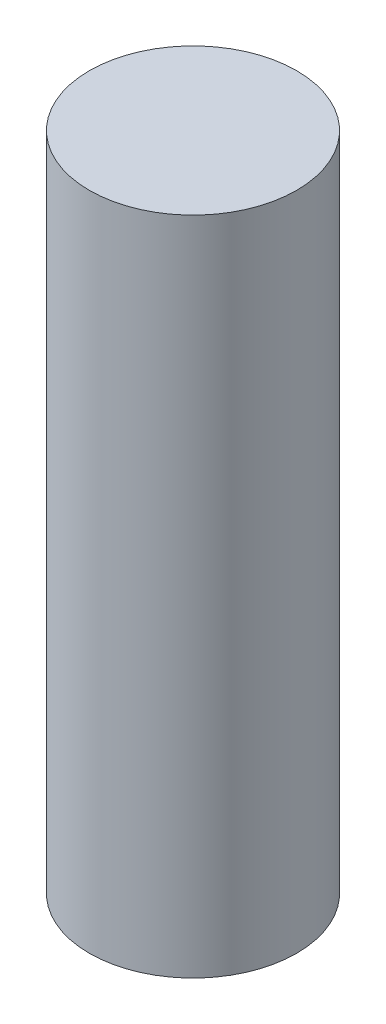
ISO-10303-21;
HEADER;
FILE_DESCRIPTION(('STEP AP214'),'2;1');
FILE_NAME('part.step','',(''),(''),'','','');
FILE_SCHEMA(('AUTOMOTIVE_DESIGN { 1 0 10303 214 1 1 1 1 }'));
ENDSEC;
DATA;
#1=APPLICATION_CONTEXT('core data for automotive mechanical design processes');
#2=APPLICATION_PROTOCOL_DEFINITION('international standard','automotive_design',2000,#1);
#3=PRODUCT_CONTEXT('',#1,'mechanical');
#4=PRODUCT('Part','Part','',(#3));
#5=PRODUCT_RELATED_PRODUCT_CATEGORY('part','',(#4));
#6=PRODUCT_DEFINITION_FORMATION('','',#4);
#7=PRODUCT_DEFINITION_CONTEXT('part definition',#1,'design');
#8=PRODUCT_DEFINITION('design','',#6,#7);
#9=PRODUCT_DEFINITION_SHAPE('','',#8);
#10=(LENGTH_UNIT() NAMED_UNIT(*) SI_UNIT(.MILLI.,.METRE.));
#11=(NAMED_UNIT(*) PLANE_ANGLE_UNIT() SI_UNIT($,.RADIAN.));
#12=(NAMED_UNIT(*) SI_UNIT($,.STERADIAN.) SOLID_ANGLE_UNIT());
#13=UNCERTAINTY_MEASURE_WITH_UNIT(LENGTH_MEASURE(1.E-05),#10,'distance_accuracy_value','');
#14=(GEOMETRIC_REPRESENTATION_CONTEXT(3) GLOBAL_UNCERTAINTY_ASSIGNED_CONTEXT((#13)) GLOBAL_UNIT_ASSIGNED_CONTEXT((#10,
#11,#12)) REPRESENTATION_CONTEXT('',''));
#15=CARTESIAN_POINT('',(0.,0.,0.));
#16=DIRECTION('',(0.,0.,1.));
#17=DIRECTION('',(1.,0.,0.));
#18=AXIS2_PLACEMENT_3D('',#15,#16,#17);
#19=CARTESIAN_POINT('',(0.,0.,0.));
#20=DIRECTION('',(0.,-1.,0.));
#21=DIRECTION('',(0.,0.,-1.));
#22=AXIS2_PLACEMENT_3D('',#19,#20,#21);
#23=PLANE('',#22);
#24=CARTESIAN_POINT('',(0.,0.,0.));
#25=DIRECTION('',(0.,-1.,0.));
#26=DIRECTION('',(0.,0.,-1.));
#27=AXIS2_PLACEMENT_3D('',#24,#25,#26);
#28=CIRCLE('',#27,4.);
#29=CARTESIAN_POINT('',(0.,0.,-4.));
#30=VERTEX_POINT('',#29);
#31=EDGE_CURVE('E10',#30,#30,#28,.T.);
#32=ORIENTED_EDGE('',*,*,#31,.T.);
#33=EDGE_LOOP('',(#32));
#34=FACE_BOUND('',#33,.T.);
#35=ADVANCED_FACE('F37',(#34),#23,.T.);
#36=CARTESIAN_POINT('',(0.,0.,0.));
#37=DIRECTION('',(0.,-1.,0.));
#38=DIRECTION('',(0.,0.,-1.));
#39=AXIS2_PLACEMENT_3D('',#36,#37,#38);
#40=CYLINDRICAL_SURFACE('',#39,4.);
#41=CARTESIAN_POINT('',(0.,25.5,0.));
#42=DIRECTION('',(0.,-1.,0.));
#43=DIRECTION('',(0.,0.,-1.));
#44=AXIS2_PLACEMENT_3D('',#41,#42,#43);
#45=CIRCLE('',#44,4.);
#46=CARTESIAN_POINT('',(0.,25.5,-4.));
#47=VERTEX_POINT('',#46);
#48=EDGE_CURVE('E43',#47,#47,#45,.T.);
#49=ORIENTED_EDGE('',*,*,#48,.T.);
#50=EDGE_LOOP('',(#49));
#51=FACE_BOUND('',#50,.T.);
#52=ORIENTED_EDGE('',*,*,#31,.F.);
#53=EDGE_LOOP('',(#52));
#54=FACE_BOUND('',#53,.T.);
#55=ADVANCED_FACE('F49',(#51,#54),#40,.T.);
#56=CARTESIAN_POINT('',(4.,25.5,0.));
#57=DIRECTION('',(0.,1.,0.));
#58=DIRECTION('',(0.,0.,1.));
#59=AXIS2_PLACEMENT_3D('',#56,#57,#58);
#60=PLANE('',#59);
#61=ORIENTED_EDGE('',*,*,#48,.F.);
#62=EDGE_LOOP('',(#61));
#63=FACE_BOUND('',#62,.T.);
#64=ADVANCED_FACE('F52',(#63),#60,.T.);
#65=CLOSED_SHELL('',(#35,#55,#64));
#66=MANIFOLD_SOLID_BREP('B2',#65);
#67=ADVANCED_BREP_SHAPE_REPRESENTATION('',(#18,#66),#14);
#68=SHAPE_DEFINITION_REPRESENTATION(#9,#67);
ENDSEC;
END-ISO-10303-21;
